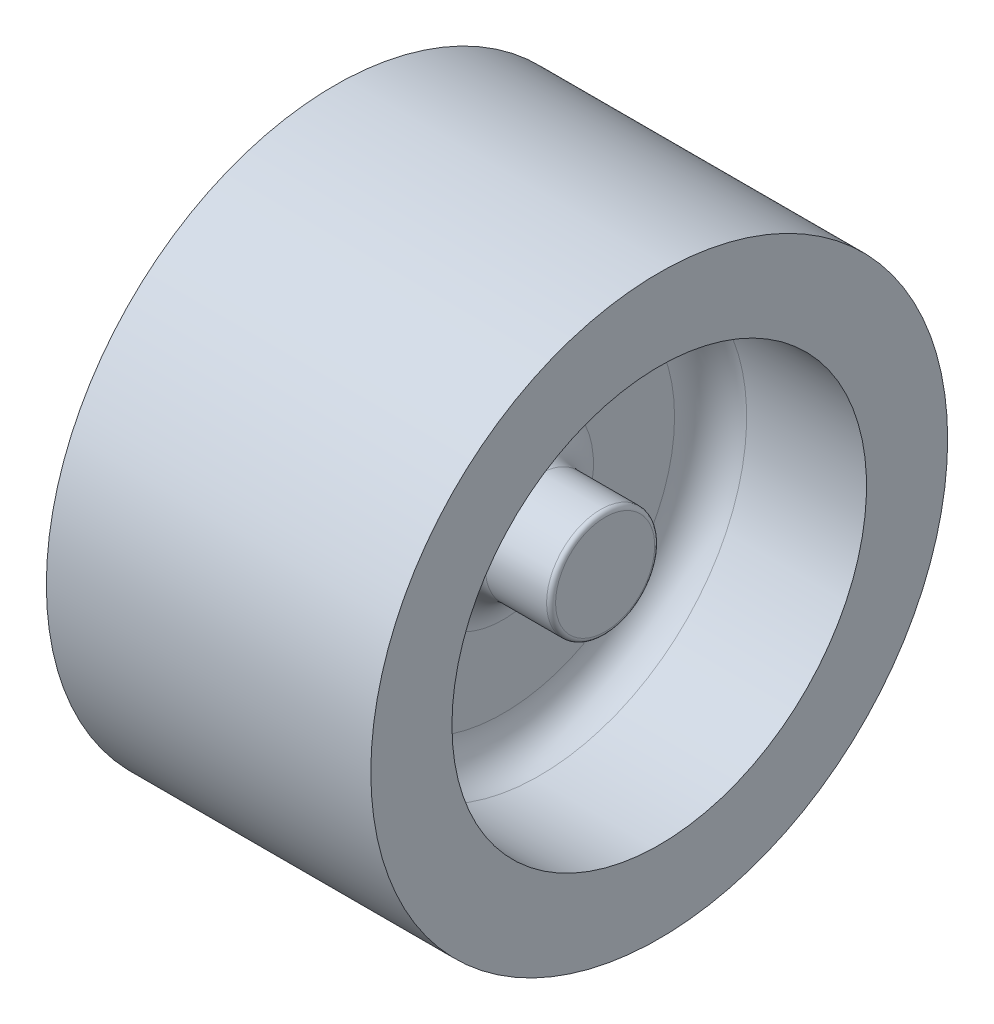
ISO-10303-21;
HEADER;
FILE_DESCRIPTION(('STEP AP214'),'2;1');
FILE_NAME('part.step','',(''),(''),'','','');
FILE_SCHEMA(('AUTOMOTIVE_DESIGN { 1 0 10303 214 1 1 1 1 }'));
ENDSEC;
DATA;
#1=APPLICATION_CONTEXT('core data for automotive mechanical design processes');
#2=APPLICATION_PROTOCOL_DEFINITION('international standard','automotive_design',2000,#1);
#3=PRODUCT_CONTEXT('',#1,'mechanical');
#4=PRODUCT('Part','Part','',(#3));
#5=PRODUCT_RELATED_PRODUCT_CATEGORY('part','',(#4));
#6=PRODUCT_DEFINITION_FORMATION('','',#4);
#7=PRODUCT_DEFINITION_CONTEXT('part definition',#1,'design');
#8=PRODUCT_DEFINITION('design','',#6,#7);
#9=PRODUCT_DEFINITION_SHAPE('','',#8);
#10=(LENGTH_UNIT() NAMED_UNIT(*) SI_UNIT(.MILLI.,.METRE.));
#11=(NAMED_UNIT(*) PLANE_ANGLE_UNIT() SI_UNIT($,.RADIAN.));
#12=(NAMED_UNIT(*) SI_UNIT($,.STERADIAN.) SOLID_ANGLE_UNIT());
#13=UNCERTAINTY_MEASURE_WITH_UNIT(LENGTH_MEASURE(1.E-05),#10,'distance_accuracy_value','');
#14=(GEOMETRIC_REPRESENTATION_CONTEXT(3) GLOBAL_UNCERTAINTY_ASSIGNED_CONTEXT((#13)) GLOBAL_UNIT_ASSIGNED_CONTEXT((#10,
#11,#12)) REPRESENTATION_CONTEXT('',''));
#15=CARTESIAN_POINT('',(0.,0.,0.));
#16=DIRECTION('',(0.,0.,1.));
#17=DIRECTION('',(1.,0.,0.));
#18=AXIS2_PLACEMENT_3D('',#15,#16,#17);
#19=CARTESIAN_POINT('',(-4.3525380036405,3.125,0.));
#20=DIRECTION('',(1.,0.,0.));
#21=DIRECTION('',(0.,0.,-1.));
#22=AXIS2_PLACEMENT_3D('',#19,#20,#21);
#23=PLANE('',#22);
#24=CARTESIAN_POINT('',(-4.3525380036405,0.,0.));
#25=DIRECTION('',(-1.,0.,0.));
#26=DIRECTION('',(0.,0.,1.));
#27=AXIS2_PLACEMENT_3D('',#24,#25,#26);
#28=CIRCLE('',#27,1.55);
#29=CARTESIAN_POINT('',(-4.3525380036405,0.,1.55));
#30=VERTEX_POINT('',#29);
#31=EDGE_CURVE('E105',#30,#30,#28,.T.);
#32=ORIENTED_EDGE('',*,*,#31,.F.);
#33=EDGE_LOOP('',(#32));
#34=FACE_BOUND('',#33,.T.);
#35=CARTESIAN_POINT('',(-4.3525380036405,0.,0.));
#36=DIRECTION('',(-1.,0.,0.));
#37=DIRECTION('',(0.,0.,1.));
#38=AXIS2_PLACEMENT_3D('',#35,#36,#37);
#39=CIRCLE('',#38,3.125);
#40=CARTESIAN_POINT('',(-4.3525380036405,0.,3.125));
#41=VERTEX_POINT('',#40);
#42=EDGE_CURVE('E10',#41,#41,#39,.T.);
#43=ORIENTED_EDGE('',*,*,#42,.T.);
#44=EDGE_LOOP('',(#43));
#45=FACE_BOUND('',#44,.T.);
#46=ADVANCED_FACE('F34',(#34,#45),#23,.F.);
#47=CARTESIAN_POINT('',(0.,0.,0.));
#48=DIRECTION('',(-1.,0.,0.));
#49=DIRECTION('',(0.,0.,1.));
#50=AXIS2_PLACEMENT_3D('',#47,#48,#49);
#51=CYLINDRICAL_SURFACE('',#50,3.125);
#52=ORIENTED_EDGE('',*,*,#42,.F.);
#53=EDGE_LOOP('',(#52));
#54=FACE_BOUND('',#53,.T.);
#55=CARTESIAN_POINT('',(0.147461996359501,0.,0.));
#56=DIRECTION('',(-1.,0.,0.));
#57=DIRECTION('',(0.,0.,1.));
#58=AXIS2_PLACEMENT_3D('',#55,#56,#57);
#59=CIRCLE('',#58,3.125);
#60=CARTESIAN_POINT('',(0.147461996359501,0.,3.125));
#61=VERTEX_POINT('',#60);
#62=EDGE_CURVE('E40',#61,#61,#59,.T.);
#63=ORIENTED_EDGE('',*,*,#62,.T.);
#64=EDGE_LOOP('',(#63));
#65=FACE_BOUND('',#64,.T.);
#66=ADVANCED_FACE('F121',(#54,#65),#51,.T.);
#67=CARTESIAN_POINT('',(0.147461996359501,0.,0.));
#68=DIRECTION('',(-1.,0.,0.));
#69=DIRECTION('',(0.,0.,1.));
#70=AXIS2_PLACEMENT_3D('',#67,#68,#69);
#71=TOROIDAL_SURFACE('',#70,3.375,0.250000000000002);
#72=ORIENTED_EDGE('',*,*,#62,.F.);
#73=EDGE_LOOP('',(#72));
#74=FACE_BOUND('',#73,.T.);
#75=CARTESIAN_POINT('',(0.397461996359503,0.,0.));
#76=DIRECTION('',(-1.,0.,0.));
#77=DIRECTION('',(0.,0.,1.));
#78=AXIS2_PLACEMENT_3D('',#75,#76,#77);
#79=CIRCLE('',#78,3.375);
#80=CARTESIAN_POINT('',(0.397461996359503,0.,3.375));
#81=VERTEX_POINT('',#80);
#82=EDGE_CURVE('E44',#81,#81,#79,.T.);
#83=ORIENTED_EDGE('',*,*,#82,.T.);
#84=EDGE_LOOP('',(#83));
#85=FACE_BOUND('',#84,.T.);
#86=ADVANCED_FACE('F125',(#74,#85),#71,.F.);
#87=CARTESIAN_POINT('',(0.397461996359503,4.5,0.));
#88=DIRECTION('',(1.,0.,0.));
#89=DIRECTION('',(0.,0.,-1.));
#90=AXIS2_PLACEMENT_3D('',#87,#88,#89);
#91=PLANE('',#90);
#92=ORIENTED_EDGE('',*,*,#82,.F.);
#93=EDGE_LOOP('',(#92));
#94=FACE_BOUND('',#93,.T.);
#95=CARTESIAN_POINT('',(0.397461996359503,0.,0.));
#96=DIRECTION('',(-1.,0.,0.));
#97=DIRECTION('',(0.,0.,1.));
#98=AXIS2_PLACEMENT_3D('',#95,#96,#97);
#99=CIRCLE('',#98,4.5);
#100=CARTESIAN_POINT('',(0.397461996359503,0.,4.5));
#101=VERTEX_POINT('',#100);
#102=EDGE_CURVE('E48',#101,#101,#99,.T.);
#103=ORIENTED_EDGE('',*,*,#102,.T.);
#104=EDGE_LOOP('',(#103));
#105=FACE_BOUND('',#104,.T.);
#106=ADVANCED_FACE('F130',(#94,#105),#91,.F.);
#107=CARTESIAN_POINT('',(0.647461996359504,0.,0.));
#108=DIRECTION('',(-1.,0.,0.));
#109=DIRECTION('',(0.,0.,1.));
#110=AXIS2_PLACEMENT_3D('',#107,#108,#109);
#111=TOROIDAL_SURFACE('',#110,4.5,0.250000000000002);
#112=ORIENTED_EDGE('',*,*,#102,.F.);
#113=EDGE_LOOP('',(#112));
#114=FACE_BOUND('',#113,.T.);
#115=CARTESIAN_POINT('',(0.647461996359504,0.,0.));
#116=DIRECTION('',(-1.,0.,0.));
#117=DIRECTION('',(0.,0.,1.));
#118=AXIS2_PLACEMENT_3D('',#115,#116,#117);
#119=CIRCLE('',#118,4.75);
#120=CARTESIAN_POINT('',(0.647461996359504,0.,4.75));
#121=VERTEX_POINT('',#120);
#122=EDGE_CURVE('E53',#121,#121,#119,.T.);
#123=ORIENTED_EDGE('',*,*,#122,.T.);
#124=EDGE_LOOP('',(#123));
#125=FACE_BOUND('',#124,.T.);
#126=ADVANCED_FACE('F136',(#114,#125),#111,.T.);
#127=CARTESIAN_POINT('',(0.,0.,0.));
#128=DIRECTION('',(-1.,0.,0.));
#129=DIRECTION('',(0.,0.,1.));
#130=AXIS2_PLACEMENT_3D('',#127,#128,#129);
#131=CYLINDRICAL_SURFACE('',#130,4.75);
#132=ORIENTED_EDGE('',*,*,#122,.F.);
#133=EDGE_LOOP('',(#132));
#134=FACE_BOUND('',#133,.T.);
#135=CARTESIAN_POINT('',(2.1474619963595,0.,0.));
#136=DIRECTION('',(-1.,0.,0.));
#137=DIRECTION('',(0.,0.,1.));
#138=AXIS2_PLACEMENT_3D('',#135,#136,#137);
#139=CIRCLE('',#138,4.75);
#140=CARTESIAN_POINT('',(2.1474619963595,0.,4.75));
#141=VERTEX_POINT('',#140);
#142=EDGE_CURVE('E56',#141,#141,#139,.T.);
#143=ORIENTED_EDGE('',*,*,#142,.T.);
#144=EDGE_LOOP('',(#143));
#145=FACE_BOUND('',#144,.T.);
#146=ADVANCED_FACE('F140',(#134,#145),#131,.T.);
#147=CARTESIAN_POINT('',(2.1474619963595,0.,0.));
#148=DIRECTION('',(-1.,0.,0.));
#149=DIRECTION('',(0.,0.,1.));
#150=AXIS2_PLACEMENT_3D('',#147,#148,#149);
#151=TOROIDAL_SURFACE('',#150,5.,0.250000000000002);
#152=ORIENTED_EDGE('',*,*,#142,.F.);
#153=EDGE_LOOP('',(#152));
#154=FACE_BOUND('',#153,.T.);
#155=CARTESIAN_POINT('',(2.3974619963595,0.,0.));
#156=DIRECTION('',(-1.,0.,0.));
#157=DIRECTION('',(0.,0.,1.));
#158=AXIS2_PLACEMENT_3D('',#155,#156,#157);
#159=CIRCLE('',#158,5.);
#160=CARTESIAN_POINT('',(2.3974619963595,0.,5.));
#161=VERTEX_POINT('',#160);
#162=EDGE_CURVE('E59',#161,#161,#159,.T.);
#163=ORIENTED_EDGE('',*,*,#162,.T.);
#164=EDGE_LOOP('',(#163));
#165=FACE_BOUND('',#164,.T.);
#166=ADVANCED_FACE('F144',(#154,#165),#151,.F.);
#167=CARTESIAN_POINT('',(2.3974619963595,11.,0.));
#168=DIRECTION('',(1.,0.,0.));
#169=DIRECTION('',(0.,0.,-1.));
#170=AXIS2_PLACEMENT_3D('',#167,#168,#169);
#171=PLANE('',#170);
#172=ORIENTED_EDGE('',*,*,#162,.F.);
#173=EDGE_LOOP('',(#172));
#174=FACE_BOUND('',#173,.T.);
#175=CARTESIAN_POINT('',(2.3974619963595,0.,0.));
#176=DIRECTION('',(-1.,0.,0.));
#177=DIRECTION('',(0.,0.,1.));
#178=AXIS2_PLACEMENT_3D('',#175,#176,#177);
#179=CIRCLE('',#178,11.);
#180=CARTESIAN_POINT('',(2.3974619963595,0.,11.));
#181=VERTEX_POINT('',#180);
#182=EDGE_CURVE('E62',#181,#181,#179,.T.);
#183=ORIENTED_EDGE('',*,*,#182,.T.);
#184=EDGE_LOOP('',(#183));
#185=FACE_BOUND('',#184,.T.);
#186=ADVANCED_FACE('F148',(#174,#185),#171,.F.);
#187=CARTESIAN_POINT('',(4.3974619963595,0.,0.));
#188=DIRECTION('',(-1.,0.,0.));
#189=DIRECTION('',(0.,0.,1.));
#190=AXIS2_PLACEMENT_3D('',#187,#188,#189);
#191=TOROIDAL_SURFACE('',#190,11.,2.);
#192=ORIENTED_EDGE('',*,*,#182,.F.);
#193=EDGE_LOOP('',(#192));
#194=FACE_BOUND('',#193,.T.);
#195=CARTESIAN_POINT('',(4.3974619963595,0.,0.));
#196=DIRECTION('',(-1.,0.,0.));
#197=DIRECTION('',(0.,0.,1.));
#198=AXIS2_PLACEMENT_3D('',#195,#196,#197);
#199=CIRCLE('',#198,13.);
#200=CARTESIAN_POINT('',(4.3974619963595,0.,13.));
#201=VERTEX_POINT('',#200);
#202=EDGE_CURVE('E65',#201,#201,#199,.T.);
#203=ORIENTED_EDGE('',*,*,#202,.T.);
#204=EDGE_LOOP('',(#203));
#205=FACE_BOUND('',#204,.T.);
#206=ADVANCED_FACE('F152',(#194,#205),#191,.T.);
#207=CARTESIAN_POINT('',(0.,0.,0.));
#208=DIRECTION('',(-1.,0.,0.));
#209=DIRECTION('',(0.,0.,1.));
#210=AXIS2_PLACEMENT_3D('',#207,#208,#209);
#211=CYLINDRICAL_SURFACE('',#210,13.);
#212=ORIENTED_EDGE('',*,*,#202,.F.);
#213=EDGE_LOOP('',(#212));
#214=FACE_BOUND('',#213,.T.);
#215=CARTESIAN_POINT('',(11.1474619963595,0.,0.));
#216=DIRECTION('',(-1.,0.,0.));
#217=DIRECTION('',(0.,0.,1.));
#218=AXIS2_PLACEMENT_3D('',#215,#216,#217);
#219=CIRCLE('',#218,13.);
#220=CARTESIAN_POINT('',(11.1474619963595,0.,13.));
#221=VERTEX_POINT('',#220);
#222=EDGE_CURVE('E68',#221,#221,#219,.T.);
#223=ORIENTED_EDGE('',*,*,#222,.T.);
#224=EDGE_LOOP('',(#223));
#225=FACE_BOUND('',#224,.T.);
#226=ADVANCED_FACE('F156',(#214,#225),#211,.T.);
#227=CARTESIAN_POINT('',(11.1474619963595,13.,0.));
#228=DIRECTION('',(1.,0.,0.));
#229=DIRECTION('',(0.,0.,-1.));
#230=AXIS2_PLACEMENT_3D('',#227,#228,#229);
#231=PLANE('',#230);
#232=ORIENTED_EDGE('',*,*,#222,.F.);
#233=EDGE_LOOP('',(#232));
#234=FACE_BOUND('',#233,.T.);
#235=CARTESIAN_POINT('',(11.1474619963595,0.,0.));
#236=DIRECTION('',(-1.,0.,0.));
#237=DIRECTION('',(0.,0.,1.));
#238=AXIS2_PLACEMENT_3D('',#235,#236,#237);
#239=CIRCLE('',#238,14.25);
#240=CARTESIAN_POINT('',(11.1474619963595,0.,14.25));
#241=VERTEX_POINT('',#240);
#242=EDGE_CURVE('E71',#241,#241,#239,.T.);
#243=ORIENTED_EDGE('',*,*,#242,.T.);
#244=EDGE_LOOP('',(#243));
#245=FACE_BOUND('',#244,.T.);
#246=ADVANCED_FACE('F160',(#234,#245),#231,.F.);
#247=CARTESIAN_POINT('',(0.,0.,0.));
#248=DIRECTION('',(-1.,0.,0.));
#249=DIRECTION('',(0.,0.,1.));
#250=AXIS2_PLACEMENT_3D('',#247,#248,#249);
#251=CYLINDRICAL_SURFACE('',#250,14.25);
#252=ORIENTED_EDGE('',*,*,#242,.F.);
#253=EDGE_LOOP('',(#252));
#254=FACE_BOUND('',#253,.T.);
#255=CARTESIAN_POINT('',(-3.3525380036405,0.,0.));
#256=DIRECTION('',(-1.,0.,0.));
#257=DIRECTION('',(0.,0.,1.));
#258=AXIS2_PLACEMENT_3D('',#255,#256,#257);
#259=CIRCLE('',#258,14.25);
#260=CARTESIAN_POINT('',(-3.3525380036405,0.,14.25));
#261=VERTEX_POINT('',#260);
#262=EDGE_CURVE('E74',#261,#261,#259,.T.);
#263=ORIENTED_EDGE('',*,*,#262,.T.);
#264=EDGE_LOOP('',(#263));
#265=FACE_BOUND('',#264,.T.);
#266=ADVANCED_FACE('F164',(#254,#265),#251,.F.);
#267=CARTESIAN_POINT('',(-3.3525380036405,14.25,0.));
#268=DIRECTION('',(1.,0.,0.));
#269=DIRECTION('',(0.,0.,-1.));
#270=AXIS2_PLACEMENT_3D('',#267,#268,#269);
#271=PLANE('',#270);
#272=ORIENTED_EDGE('',*,*,#262,.F.);
#273=EDGE_LOOP('',(#272));
#274=FACE_BOUND('',#273,.T.);
#275=CARTESIAN_POINT('',(-3.3525380036405,0.,0.));
#276=DIRECTION('',(-1.,0.,0.));
#277=DIRECTION('',(0.,0.,1.));
#278=AXIS2_PLACEMENT_3D('',#275,#276,#277);
#279=CIRCLE('',#278,16.);
#280=CARTESIAN_POINT('',(-3.3525380036405,0.,16.));
#281=VERTEX_POINT('',#280);
#282=EDGE_CURVE('E77',#281,#281,#279,.T.);
#283=ORIENTED_EDGE('',*,*,#282,.T.);
#284=EDGE_LOOP('',(#283));
#285=FACE_BOUND('',#284,.T.);
#286=ADVANCED_FACE('F168',(#274,#285),#271,.F.);
#287=CARTESIAN_POINT('',(0.,0.,0.));
#288=DIRECTION('',(-1.,0.,0.));
#289=DIRECTION('',(0.,0.,1.));
#290=AXIS2_PLACEMENT_3D('',#287,#288,#289);
#291=CYLINDRICAL_SURFACE('',#290,16.);
#292=ORIENTED_EDGE('',*,*,#282,.F.);
#293=EDGE_LOOP('',(#292));
#294=FACE_BOUND('',#293,.T.);
#295=CARTESIAN_POINT('',(14.6474619963595,0.,0.));
#296=DIRECTION('',(-1.,0.,0.));
#297=DIRECTION('',(0.,0.,1.));
#298=AXIS2_PLACEMENT_3D('',#295,#296,#297);
#299=CIRCLE('',#298,16.);
#300=CARTESIAN_POINT('',(14.6474619963595,0.,16.));
#301=VERTEX_POINT('',#300);
#302=EDGE_CURVE('E80',#301,#301,#299,.T.);
#303=ORIENTED_EDGE('',*,*,#302,.T.);
#304=EDGE_LOOP('',(#303));
#305=FACE_BOUND('',#304,.T.);
#306=ADVANCED_FACE('F172',(#294,#305),#291,.T.);
#307=CARTESIAN_POINT('',(14.6474619963595,11.5,0.));
#308=DIRECTION('',(-1.,0.,0.));
#309=DIRECTION('',(0.,0.,1.));
#310=AXIS2_PLACEMENT_3D('',#307,#308,#309);
#311=PLANE('',#310);
#312=ORIENTED_EDGE('',*,*,#302,.F.);
#313=EDGE_LOOP('',(#312));
#314=FACE_BOUND('',#313,.T.);
#315=CARTESIAN_POINT('',(14.6474619963595,0.,0.));
#316=DIRECTION('',(-1.,0.,0.));
#317=DIRECTION('',(0.,0.,1.));
#318=AXIS2_PLACEMENT_3D('',#315,#316,#317);
#319=CIRCLE('',#318,11.5);
#320=CARTESIAN_POINT('',(14.6474619963595,0.,11.5));
#321=VERTEX_POINT('',#320);
#322=EDGE_CURVE('E83',#321,#321,#319,.T.);
#323=ORIENTED_EDGE('',*,*,#322,.T.);
#324=EDGE_LOOP('',(#323));
#325=FACE_BOUND('',#324,.T.);
#326=ADVANCED_FACE('F176',(#314,#325),#311,.F.);
#327=CARTESIAN_POINT('',(0.,0.,0.));
#328=DIRECTION('',(-1.,0.,0.));
#329=DIRECTION('',(0.,0.,1.));
#330=AXIS2_PLACEMENT_3D('',#327,#328,#329);
#331=CYLINDRICAL_SURFACE('',#330,11.5);
#332=ORIENTED_EDGE('',*,*,#322,.F.);
#333=EDGE_LOOP('',(#332));
#334=FACE_BOUND('',#333,.T.);
#335=CARTESIAN_POINT('',(7.9974619963595,0.,0.));
#336=DIRECTION('',(-1.,0.,0.));
#337=DIRECTION('',(0.,0.,1.));
#338=AXIS2_PLACEMENT_3D('',#335,#336,#337);
#339=CIRCLE('',#338,11.5);
#340=CARTESIAN_POINT('',(7.9974619963595,0.,11.5));
#341=VERTEX_POINT('',#340);
#342=EDGE_CURVE('E86',#341,#341,#339,.T.);
#343=ORIENTED_EDGE('',*,*,#342,.T.);
#344=EDGE_LOOP('',(#343));
#345=FACE_BOUND('',#344,.T.);
#346=ADVANCED_FACE('F180',(#334,#345),#331,.F.);
#347=CARTESIAN_POINT('',(7.9974619963595,0.,0.));
#348=DIRECTION('',(-1.,0.,0.));
#349=DIRECTION('',(0.,0.,1.));
#350=AXIS2_PLACEMENT_3D('',#347,#348,#349);
#351=TOROIDAL_SURFACE('',#350,9.5,2.);
#352=ORIENTED_EDGE('',*,*,#342,.F.);
#353=EDGE_LOOP('',(#352));
#354=FACE_BOUND('',#353,.T.);
#355=CARTESIAN_POINT('',(5.9974619963595,0.,0.));
#356=DIRECTION('',(-1.,0.,0.));
#357=DIRECTION('',(0.,0.,1.));
#358=AXIS2_PLACEMENT_3D('',#355,#356,#357);
#359=CIRCLE('',#358,9.5);
#360=CARTESIAN_POINT('',(5.9974619963595,0.,9.5));
#361=VERTEX_POINT('',#360);
#362=EDGE_CURVE('E89',#361,#361,#359,.T.);
#363=ORIENTED_EDGE('',*,*,#362,.T.);
#364=EDGE_LOOP('',(#363));
#365=FACE_BOUND('',#364,.T.);
#366=ADVANCED_FACE('F184',(#354,#365),#351,.F.);
#367=CARTESIAN_POINT('',(5.9974619963595,5.,0.));
#368=DIRECTION('',(-1.,0.,0.));
#369=DIRECTION('',(0.,0.,1.));
#370=AXIS2_PLACEMENT_3D('',#367,#368,#369);
#371=PLANE('',#370);
#372=ORIENTED_EDGE('',*,*,#362,.F.);
#373=EDGE_LOOP('',(#372));
#374=FACE_BOUND('',#373,.T.);
#375=CARTESIAN_POINT('',(5.9974619963595,0.,0.));
#376=DIRECTION('',(-1.,0.,0.));
#377=DIRECTION('',(0.,0.,1.));
#378=AXIS2_PLACEMENT_3D('',#375,#376,#377);
#379=CIRCLE('',#378,5.);
#380=CARTESIAN_POINT('',(5.9974619963595,0.,5.));
#381=VERTEX_POINT('',#380);
#382=EDGE_CURVE('E92',#381,#381,#379,.T.);
#383=ORIENTED_EDGE('',*,*,#382,.T.);
#384=EDGE_LOOP('',(#383));
#385=FACE_BOUND('',#384,.T.);
#386=ADVANCED_FACE('F188',(#374,#385),#371,.F.);
#387=CARTESIAN_POINT('',(7.9974619963595,0.,0.));
#388=DIRECTION('',(-1.,0.,0.));
#389=DIRECTION('',(0.,0.,1.));
#390=AXIS2_PLACEMENT_3D('',#387,#388,#389);
#391=TOROIDAL_SURFACE('',#390,5.,2.);
#392=ORIENTED_EDGE('',*,*,#382,.F.);
#393=EDGE_LOOP('',(#392));
#394=FACE_BOUND('',#393,.T.);
#395=CARTESIAN_POINT('',(7.9974619963595,0.,0.));
#396=DIRECTION('',(-1.,0.,0.));
#397=DIRECTION('',(0.,0.,1.));
#398=AXIS2_PLACEMENT_3D('',#395,#396,#397);
#399=CIRCLE('',#398,3.);
#400=CARTESIAN_POINT('',(7.9974619963595,0.,3.));
#401=VERTEX_POINT('',#400);
#402=EDGE_CURVE('E95',#401,#401,#399,.T.);
#403=ORIENTED_EDGE('',*,*,#402,.T.);
#404=EDGE_LOOP('',(#403));
#405=FACE_BOUND('',#404,.T.);
#406=ADVANCED_FACE('F192',(#394,#405),#391,.F.);
#407=CARTESIAN_POINT('',(0.,0.,0.));
#408=DIRECTION('',(-1.,0.,0.));
#409=DIRECTION('',(0.,0.,1.));
#410=AXIS2_PLACEMENT_3D('',#407,#408,#409);
#411=CYLINDRICAL_SURFACE('',#410,3.);
#412=ORIENTED_EDGE('',*,*,#402,.F.);
#413=EDGE_LOOP('',(#412));
#414=FACE_BOUND('',#413,.T.);
#415=CARTESIAN_POINT('',(11.3974619963595,0.,0.));
#416=DIRECTION('',(-1.,0.,0.));
#417=DIRECTION('',(0.,0.,1.));
#418=AXIS2_PLACEMENT_3D('',#415,#416,#417);
#419=CIRCLE('',#418,3.);
#420=CARTESIAN_POINT('',(11.3974619963595,0.,3.));
#421=VERTEX_POINT('',#420);
#422=EDGE_CURVE('E98',#421,#421,#419,.T.);
#423=ORIENTED_EDGE('',*,*,#422,.T.);
#424=EDGE_LOOP('',(#423));
#425=FACE_BOUND('',#424,.T.);
#426=ADVANCED_FACE('F196',(#414,#425),#411,.T.);
#427=CARTESIAN_POINT('',(11.3974619963595,0.,0.));
#428=DIRECTION('',(-1.,0.,0.));
#429=DIRECTION('',(0.,0.,1.));
#430=AXIS2_PLACEMENT_3D('',#427,#428,#429);
#431=TOROIDAL_SURFACE('',#430,2.75,0.250000000000001);
#432=ORIENTED_EDGE('',*,*,#422,.F.);
#433=EDGE_LOOP('',(#432));
#434=FACE_BOUND('',#433,.T.);
#435=CARTESIAN_POINT('',(11.6474619963595,0.,0.));
#436=DIRECTION('',(-1.,0.,0.));
#437=DIRECTION('',(0.,0.,1.));
#438=AXIS2_PLACEMENT_3D('',#435,#436,#437);
#439=CIRCLE('',#438,2.75);
#440=CARTESIAN_POINT('',(11.6474619963595,0.,2.75));
#441=VERTEX_POINT('',#440);
#442=EDGE_CURVE('E101',#441,#441,#439,.T.);
#443=ORIENTED_EDGE('',*,*,#442,.T.);
#444=EDGE_LOOP('',(#443));
#445=FACE_BOUND('',#444,.T.);
#446=ADVANCED_FACE('F200',(#434,#445),#431,.T.);
#447=CARTESIAN_POINT('',(11.6474619963595,2.75,0.));
#448=DIRECTION('',(-1.,0.,0.));
#449=DIRECTION('',(0.,0.,1.));
#450=AXIS2_PLACEMENT_3D('',#447,#448,#449);
#451=PLANE('',#450);
#452=ORIENTED_EDGE('',*,*,#442,.F.);
#453=EDGE_LOOP('',(#452));
#454=FACE_BOUND('',#453,.T.);
#455=ADVANCED_FACE('F116',(#454),#451,.F.);
#456=CARTESIAN_POINT('',(10.6474619963595,0.,0.));
#457=DIRECTION('',(-1.,0.,0.));
#458=DIRECTION('',(0.,0.,1.));
#459=AXIS2_PLACEMENT_3D('',#456,#457,#458);
#460=CYLINDRICAL_SURFACE('',#459,1.55);
#461=CARTESIAN_POINT('',(10.6474619963595,0.,0.));
#462=DIRECTION('',(-1.,0.,0.));
#463=DIRECTION('',(0.,0.,1.));
#464=AXIS2_PLACEMENT_3D('',#461,#462,#463);
#465=CIRCLE('',#464,1.55);
#466=CARTESIAN_POINT('',(10.6474619963595,0.,1.55));
#467=VERTEX_POINT('',#466);
#468=EDGE_CURVE('E104',#467,#467,#465,.T.);
#469=ORIENTED_EDGE('',*,*,#468,.F.);
#470=EDGE_LOOP('',(#469));
#471=FACE_BOUND('',#470,.T.);
#472=ORIENTED_EDGE('',*,*,#31,.T.);
#473=EDGE_LOOP('',(#472));
#474=FACE_BOUND('',#473,.T.);
#475=ADVANCED_FACE('F113',(#471,#474),#460,.F.);
#476=CARTESIAN_POINT('',(10.6474619963595,0.,0.));
#477=DIRECTION('',(-1.,0.,0.));
#478=DIRECTION('',(0.,0.,1.));
#479=AXIS2_PLACEMENT_3D('',#476,#477,#478);
#480=PLANE('',#479);
#481=ORIENTED_EDGE('',*,*,#468,.T.);
#482=EDGE_LOOP('',(#481));
#483=FACE_BOUND('',#482,.T.);
#484=ADVANCED_FACE('F111',(#483),#480,.T.);
#485=CLOSED_SHELL('',(#46,#66,#86,#106,#126,#146,#166,#186,#206,#226,#246,#266,#286,#306,#326,
#346,#366,#386,#406,#426,#446,#455,#475,#484));
#486=MANIFOLD_SOLID_BREP('B2',#485);
#487=ADVANCED_BREP_SHAPE_REPRESENTATION('',(#18,#486),#14);
#488=SHAPE_DEFINITION_REPRESENTATION(#9,#487);
ENDSEC;
END-ISO-10303-21;
